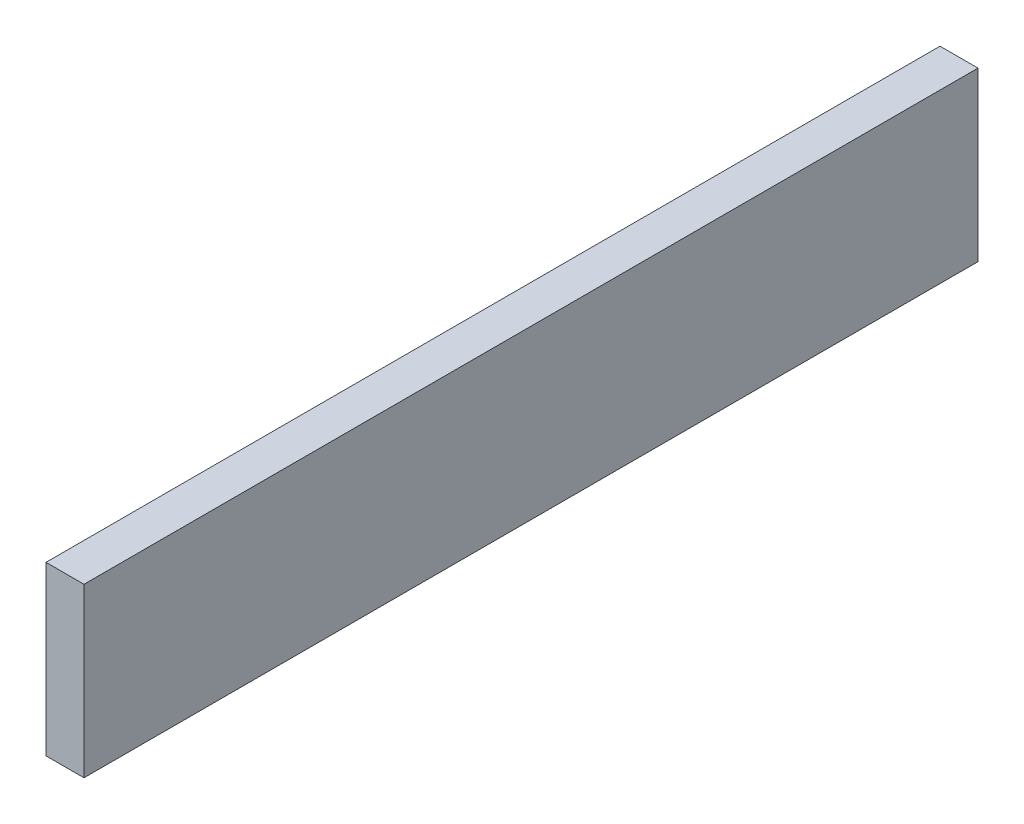
ISO-10303-21;
HEADER;
FILE_DESCRIPTION(('STEP AP214'),'2;1');
FILE_NAME('part.step','',(''),(''),'','','');
FILE_SCHEMA(('AUTOMOTIVE_DESIGN { 1 0 10303 214 1 1 1 1 }'));
ENDSEC;
DATA;
#1=APPLICATION_CONTEXT('core data for automotive mechanical design processes');
#2=APPLICATION_PROTOCOL_DEFINITION('international standard','automotive_design',2000,#1);
#3=PRODUCT_CONTEXT('',#1,'mechanical');
#4=PRODUCT('Part','Part','',(#3));
#5=PRODUCT_RELATED_PRODUCT_CATEGORY('part','',(#4));
#6=PRODUCT_DEFINITION_FORMATION('','',#4);
#7=PRODUCT_DEFINITION_CONTEXT('part definition',#1,'design');
#8=PRODUCT_DEFINITION('design','',#6,#7);
#9=PRODUCT_DEFINITION_SHAPE('','',#8);
#10=(LENGTH_UNIT() NAMED_UNIT(*) SI_UNIT(.MILLI.,.METRE.));
#11=(NAMED_UNIT(*) PLANE_ANGLE_UNIT() SI_UNIT($,.RADIAN.));
#12=(NAMED_UNIT(*) SI_UNIT($,.STERADIAN.) SOLID_ANGLE_UNIT());
#13=UNCERTAINTY_MEASURE_WITH_UNIT(LENGTH_MEASURE(1.E-05),#10,'distance_accuracy_value','');
#14=(GEOMETRIC_REPRESENTATION_CONTEXT(3) GLOBAL_UNCERTAINTY_ASSIGNED_CONTEXT((#13)) GLOBAL_UNIT_ASSIGNED_CONTEXT((#10,
#11,#12)) REPRESENTATION_CONTEXT('',''));
#15=CARTESIAN_POINT('',(0.,0.,0.));
#16=DIRECTION('',(0.,0.,1.));
#17=DIRECTION('',(1.,0.,0.));
#18=AXIS2_PLACEMENT_3D('',#15,#16,#17);
#19=CARTESIAN_POINT('',(0.,15.,0.));
#20=DIRECTION('',(1.,0.,0.));
#21=DIRECTION('',(0.,0.,-1.));
#22=AXIS2_PLACEMENT_3D('',#19,#20,#21);
#23=PLANE('',#22);
#24=DIRECTION('',(0.,0.,1.));
#25=VECTOR('',#24,1.);
#26=CARTESIAN_POINT('',(0.,0.,0.));
#27=LINE('',#26,#25);
#28=CARTESIAN_POINT('',(0.,0.,-80.));
#29=VERTEX_POINT('',#28);
#30=CARTESIAN_POINT('',(0.,0.,0.));
#31=VERTEX_POINT('',#30);
#32=EDGE_CURVE('E96',#29,#31,#27,.T.);
#33=ORIENTED_EDGE('',*,*,#32,.T.);
#34=DIRECTION('',(0.,-1.,0.));
#35=VECTOR('',#34,1.);
#36=CARTESIAN_POINT('',(0.,15.,0.));
#37=LINE('',#36,#35);
#38=CARTESIAN_POINT('',(0.,15.,0.));
#39=VERTEX_POINT('',#38);
#40=EDGE_CURVE('E11',#39,#31,#37,.T.);
#41=ORIENTED_EDGE('',*,*,#40,.F.);
#42=DIRECTION('',(0.,0.,1.));
#43=VECTOR('',#42,1.);
#44=CARTESIAN_POINT('',(0.,15.,0.));
#45=LINE('',#44,#43);
#46=CARTESIAN_POINT('',(0.,15.,-80.));
#47=VERTEX_POINT('',#46);
#48=EDGE_CURVE('E84',#47,#39,#45,.T.);
#49=ORIENTED_EDGE('',*,*,#48,.F.);
#50=DIRECTION('',(0.,-1.,0.));
#51=VECTOR('',#50,1.);
#52=CARTESIAN_POINT('',(0.,15.,-80.));
#53=LINE('',#52,#51);
#54=EDGE_CURVE('E92',#47,#29,#53,.T.);
#55=ORIENTED_EDGE('',*,*,#54,.T.);
#56=EDGE_LOOP('',(#33,#41,#49,#55));
#57=FACE_BOUND('',#56,.T.);
#58=ADVANCED_FACE('F33',(#57),#23,.F.);
#59=CARTESIAN_POINT('',(0.,15.,0.));
#60=DIRECTION('',(0.,0.,-1.));
#61=DIRECTION('',(-1.,0.,0.));
#62=AXIS2_PLACEMENT_3D('',#59,#60,#61);
#63=PLANE('',#62);
#64=DIRECTION('',(1.,0.,0.));
#65=VECTOR('',#64,1.);
#66=CARTESIAN_POINT('',(0.,0.,0.));
#67=LINE('',#66,#65);
#68=CARTESIAN_POINT('',(3.4,0.,0.));
#69=VERTEX_POINT('',#68);
#70=EDGE_CURVE('E88',#31,#69,#67,.T.);
#71=ORIENTED_EDGE('',*,*,#70,.T.);
#72=DIRECTION('',(0.,-1.,0.));
#73=VECTOR('',#72,1.);
#74=CARTESIAN_POINT('',(3.4,15.,0.));
#75=LINE('',#74,#73);
#76=CARTESIAN_POINT('',(3.4,15.,0.));
#77=VERTEX_POINT('',#76);
#78=EDGE_CURVE('E41',#77,#69,#75,.T.);
#79=ORIENTED_EDGE('',*,*,#78,.F.);
#80=DIRECTION('',(1.,0.,0.));
#81=VECTOR('',#80,1.);
#82=CARTESIAN_POINT('',(0.,15.,0.));
#83=LINE('',#82,#81);
#84=EDGE_CURVE('E79',#39,#77,#83,.T.);
#85=ORIENTED_EDGE('',*,*,#84,.F.);
#86=ORIENTED_EDGE('',*,*,#40,.T.);
#87=EDGE_LOOP('',(#71,#79,#85,#86));
#88=FACE_BOUND('',#87,.T.);
#89=ADVANCED_FACE('F87',(#88),#63,.F.);
#90=CARTESIAN_POINT('',(3.4,15.,0.));
#91=DIRECTION('',(-1.,0.,0.));
#92=DIRECTION('',(0.,0.,1.));
#93=AXIS2_PLACEMENT_3D('',#90,#91,#92);
#94=PLANE('',#93);
#95=DIRECTION('',(0.,0.,-1.));
#96=VECTOR('',#95,1.);
#97=CARTESIAN_POINT('',(3.4,0.,0.));
#98=LINE('',#97,#96);
#99=CARTESIAN_POINT('',(3.4,0.,-80.));
#100=VERTEX_POINT('',#99);
#101=EDGE_CURVE('E66',#69,#100,#98,.T.);
#102=ORIENTED_EDGE('',*,*,#101,.T.);
#103=DIRECTION('',(0.,-1.,0.));
#104=VECTOR('',#103,1.);
#105=CARTESIAN_POINT('',(3.4,15.,-80.));
#106=LINE('',#105,#104);
#107=CARTESIAN_POINT('',(3.4,15.,-80.));
#108=VERTEX_POINT('',#107);
#109=EDGE_CURVE('E89',#108,#100,#106,.T.);
#110=ORIENTED_EDGE('',*,*,#109,.F.);
#111=DIRECTION('',(0.,0.,-1.));
#112=VECTOR('',#111,1.);
#113=CARTESIAN_POINT('',(3.4,15.,0.));
#114=LINE('',#113,#112);
#115=EDGE_CURVE('E82',#77,#108,#114,.T.);
#116=ORIENTED_EDGE('',*,*,#115,.F.);
#117=ORIENTED_EDGE('',*,*,#78,.T.);
#118=EDGE_LOOP('',(#102,#110,#116,#117));
#119=FACE_BOUND('',#118,.T.);
#120=ADVANCED_FACE('F90',(#119),#94,.F.);
#121=CARTESIAN_POINT('',(0.,15.,-80.));
#122=DIRECTION('',(0.,0.,1.));
#123=DIRECTION('',(1.,0.,0.));
#124=AXIS2_PLACEMENT_3D('',#121,#122,#123);
#125=PLANE('',#124);
#126=DIRECTION('',(-1.,0.,0.));
#127=VECTOR('',#126,1.);
#128=CARTESIAN_POINT('',(0.,0.,-80.));
#129=LINE('',#128,#127);
#130=EDGE_CURVE('E72',#100,#29,#129,.T.);
#131=ORIENTED_EDGE('',*,*,#130,.T.);
#132=ORIENTED_EDGE('',*,*,#54,.F.);
#133=DIRECTION('',(-1.,0.,0.));
#134=VECTOR('',#133,1.);
#135=CARTESIAN_POINT('',(0.,15.,-80.));
#136=LINE('',#135,#134);
#137=EDGE_CURVE('E49',#108,#47,#136,.T.);
#138=ORIENTED_EDGE('',*,*,#137,.F.);
#139=ORIENTED_EDGE('',*,*,#109,.T.);
#140=EDGE_LOOP('',(#131,#132,#138,#139));
#141=FACE_BOUND('',#140,.T.);
#142=ADVANCED_FACE('F103',(#141),#125,.F.);
#143=CARTESIAN_POINT('',(0.,15.,0.));
#144=DIRECTION('',(0.,-1.,0.));
#145=DIRECTION('',(0.,0.,-1.));
#146=AXIS2_PLACEMENT_3D('',#143,#144,#145);
#147=PLANE('',#146);
#148=ORIENTED_EDGE('',*,*,#48,.T.);
#149=ORIENTED_EDGE('',*,*,#84,.T.);
#150=ORIENTED_EDGE('',*,*,#115,.T.);
#151=ORIENTED_EDGE('',*,*,#137,.T.);
#152=EDGE_LOOP('',(#148,#149,#150,#151));
#153=FACE_BOUND('',#152,.T.);
#154=ADVANCED_FACE('F80',(#153),#147,.F.);
#155=CARTESIAN_POINT('',(0.,0.,0.));
#156=DIRECTION('',(0.,-1.,0.));
#157=DIRECTION('',(0.,0.,-1.));
#158=AXIS2_PLACEMENT_3D('',#155,#156,#157);
#159=PLANE('',#158);
#160=ORIENTED_EDGE('',*,*,#32,.F.);
#161=ORIENTED_EDGE('',*,*,#130,.F.);
#162=ORIENTED_EDGE('',*,*,#101,.F.);
#163=ORIENTED_EDGE('',*,*,#70,.F.);
#164=EDGE_LOOP('',(#160,#161,#162,#163));
#165=FACE_BOUND('',#164,.T.);
#166=ADVANCED_FACE('F106',(#165),#159,.T.);
#167=CLOSED_SHELL('',(#58,#89,#120,#142,#154,#166));
#168=MANIFOLD_SOLID_BREP('B2',#167);
#169=ADVANCED_BREP_SHAPE_REPRESENTATION('',(#18,#168),#14);
#170=SHAPE_DEFINITION_REPRESENTATION(#9,#169);
ENDSEC;
END-ISO-10303-21;
